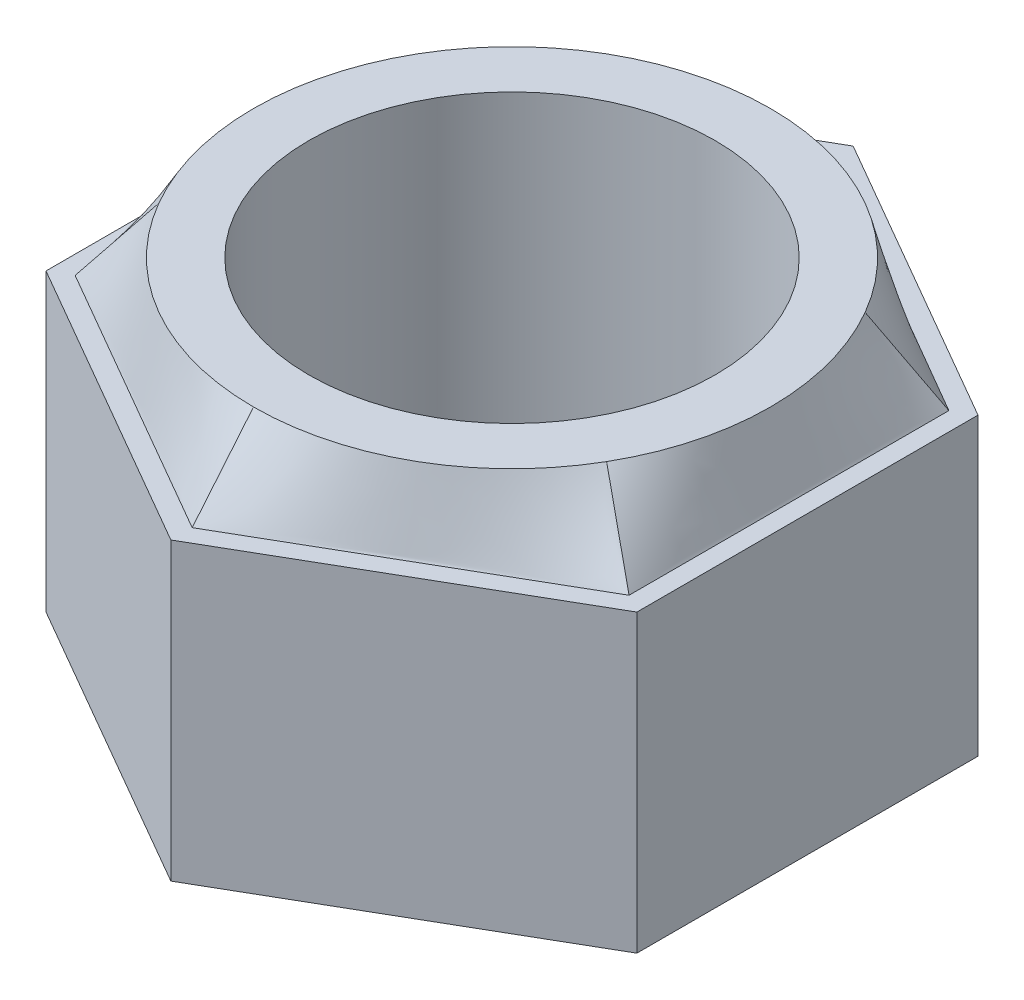
ISO-10303-21;
HEADER;
FILE_DESCRIPTION(('STEP AP214'),'2;1');
FILE_NAME('part.step','',(''),(''),'','','');
FILE_SCHEMA(('AUTOMOTIVE_DESIGN { 1 0 10303 214 1 1 1 1 }'));
ENDSEC;
DATA;
#1=APPLICATION_CONTEXT('core data for automotive mechanical design processes');
#2=APPLICATION_PROTOCOL_DEFINITION('international standard','automotive_design',2000,#1);
#3=PRODUCT_CONTEXT('',#1,'mechanical');
#4=PRODUCT('Part','Part','',(#3));
#5=PRODUCT_RELATED_PRODUCT_CATEGORY('part','',(#4));
#6=PRODUCT_DEFINITION_FORMATION('','',#4);
#7=PRODUCT_DEFINITION_CONTEXT('part definition',#1,'design');
#8=PRODUCT_DEFINITION('design','',#6,#7);
#9=PRODUCT_DEFINITION_SHAPE('','',#8);
#10=(LENGTH_UNIT() NAMED_UNIT(*) SI_UNIT(.MILLI.,.METRE.));
#11=(NAMED_UNIT(*) PLANE_ANGLE_UNIT() SI_UNIT($,.RADIAN.));
#12=(NAMED_UNIT(*) SI_UNIT($,.STERADIAN.) SOLID_ANGLE_UNIT());
#13=UNCERTAINTY_MEASURE_WITH_UNIT(LENGTH_MEASURE(1.E-05),#10,'distance_accuracy_value','');
#14=(GEOMETRIC_REPRESENTATION_CONTEXT(3) GLOBAL_UNCERTAINTY_ASSIGNED_CONTEXT((#13)) GLOBAL_UNIT_ASSIGNED_CONTEXT((#10,
#11,#12)) REPRESENTATION_CONTEXT('',''));
#15=CARTESIAN_POINT('',(0.,0.,0.));
#16=DIRECTION('',(0.,0.,1.));
#17=DIRECTION('',(1.,0.,0.));
#18=AXIS2_PLACEMENT_3D('',#15,#16,#17);
#19=CARTESIAN_POINT('',(0.,4.,0.));
#20=DIRECTION('',(0.,1.,0.));
#21=DIRECTION('',(0.,0.,1.));
#22=AXIS2_PLACEMENT_3D('',#19,#20,#21);
#23=PLANE('',#22);
#24=DIRECTION('',(-0.866025403784441,0.,-0.499999999999995));
#25=VECTOR('',#24,1.);
#26=CARTESIAN_POINT('',(3.99999999999997,4.,-2.30940107675855));
#27=LINE('',#26,#25);
#28=CARTESIAN_POINT('',(3.99999999999997,4.,-2.30940107675855));
#29=VERTEX_POINT('',#28);
#30=CARTESIAN_POINT('',(0.,4.,-4.618802153517));
#31=VERTEX_POINT('',#30);
#32=EDGE_CURVE('E188',#29,#31,#27,.T.);
#33=ORIENTED_EDGE('',*,*,#32,.T.);
#34=DIRECTION('',(-0.866025403784438,0.,0.500000000000001));
#35=VECTOR('',#34,1.);
#36=CARTESIAN_POINT('',(0.,4.,-4.618802153517));
#37=LINE('',#36,#35);
#38=CARTESIAN_POINT('',(-4.,4.,-2.30940107675849));
#39=VERTEX_POINT('',#38);
#40=EDGE_CURVE('E139',#31,#39,#37,.T.);
#41=ORIENTED_EDGE('',*,*,#40,.T.);
#42=DIRECTION('',(0.,0.,1.));
#43=VECTOR('',#42,1.);
#44=CARTESIAN_POINT('',(-4.,4.,-2.30940107675849));
#45=LINE('',#44,#43);
#46=CARTESIAN_POINT('',(-3.99999999999998,4.,2.30940107675852));
#47=VERTEX_POINT('',#46);
#48=EDGE_CURVE('E155',#39,#47,#45,.T.);
#49=ORIENTED_EDGE('',*,*,#48,.T.);
#50=DIRECTION('',(0.866025403784441,0.,0.499999999999995));
#51=VECTOR('',#50,1.);
#52=CARTESIAN_POINT('',(-3.99999999999998,4.,2.30940107675852));
#53=LINE('',#52,#51);
#54=CARTESIAN_POINT('',(0.,4.,4.618802153517));
#55=VERTEX_POINT('',#54);
#56=EDGE_CURVE('E148',#47,#55,#53,.T.);
#57=ORIENTED_EDGE('',*,*,#56,.T.);
#58=DIRECTION('',(0.866025403784434,0.,-0.500000000000007));
#59=VECTOR('',#58,1.);
#60=CARTESIAN_POINT('',(0.,4.,4.618802153517));
#61=LINE('',#60,#59);
#62=CARTESIAN_POINT('',(4.00000000000002,4.,2.30940107675846));
#63=VERTEX_POINT('',#62);
#64=EDGE_CURVE('E152',#55,#63,#61,.T.);
#65=ORIENTED_EDGE('',*,*,#64,.T.);
#66=DIRECTION('',(0.,0.,-1.));
#67=VECTOR('',#66,1.);
#68=CARTESIAN_POINT('',(4.00000000000002,4.,2.30940107675846));
#69=LINE('',#68,#67);
#70=EDGE_CURVE('E104',#63,#29,#69,.T.);
#71=ORIENTED_EDGE('',*,*,#70,.T.);
#72=EDGE_LOOP('',(#33,#41,#49,#57,#65,#71));
#73=FACE_BOUND('',#72,.T.);
#74=DIRECTION('',(-0.866025403784442,0.,-0.499999999999995));
#75=VECTOR('',#74,1.);
#76=CARTESIAN_POINT('',(3.74999999999997,4.,-2.16506350946114));
#77=LINE('',#76,#75);
#78=CARTESIAN_POINT('',(3.74999999999997,4.,-2.16506350946114));
#79=VERTEX_POINT('',#78);
#80=CARTESIAN_POINT('',(0.,4.,-4.33012701892219));
#81=VERTEX_POINT('',#80);
#82=EDGE_CURVE('E196',#79,#81,#77,.T.);
#83=ORIENTED_EDGE('',*,*,#82,.F.);
#84=DIRECTION('',(0.,0.,-1.));
#85=VECTOR('',#84,1.);
#86=CARTESIAN_POINT('',(3.75000000000001,4.,2.16506350946106));
#87=LINE('',#86,#85);
#88=CARTESIAN_POINT('',(3.75000000000001,4.,2.16506350946106));
#89=VERTEX_POINT('',#88);
#90=EDGE_CURVE('E194',#89,#79,#87,.T.);
#91=ORIENTED_EDGE('',*,*,#90,.F.);
#92=DIRECTION('',(0.866025403784435,0.,-0.500000000000007));
#93=VECTOR('',#92,1.);
#94=CARTESIAN_POINT('',(0.,4.,4.33012701892219));
#95=LINE('',#94,#93);
#96=CARTESIAN_POINT('',(0.,4.,4.33012701892219));
#97=VERTEX_POINT('',#96);
#98=EDGE_CURVE('E200',#97,#89,#95,.T.);
#99=ORIENTED_EDGE('',*,*,#98,.F.);
#100=DIRECTION('',(0.866025403784441,0.,0.499999999999995));
#101=VECTOR('',#100,1.);
#102=CARTESIAN_POINT('',(-3.74999999999998,4.,2.16506350946111));
#103=LINE('',#102,#101);
#104=CARTESIAN_POINT('',(-3.74999999999998,4.,2.16506350946111));
#105=VERTEX_POINT('',#104);
#106=EDGE_CURVE('E204',#105,#97,#103,.T.);
#107=ORIENTED_EDGE('',*,*,#106,.F.);
#108=DIRECTION('',(0.,0.,1.));
#109=VECTOR('',#108,1.);
#110=CARTESIAN_POINT('',(-3.75,4.,-2.16506350946108));
#111=LINE('',#110,#109);
#112=CARTESIAN_POINT('',(-3.75,4.,-2.16506350946108));
#113=VERTEX_POINT('',#112);
#114=EDGE_CURVE('E209',#113,#105,#111,.T.);
#115=ORIENTED_EDGE('',*,*,#114,.F.);
#116=DIRECTION('',(-0.866025403784438,0.,0.500000000000001));
#117=VECTOR('',#116,1.);
#118=CARTESIAN_POINT('',(0.,4.,-4.33012701892219));
#119=LINE('',#118,#117);
#120=EDGE_CURVE('E214',#81,#113,#119,.T.);
#121=ORIENTED_EDGE('',*,*,#120,.F.);
#122=EDGE_LOOP('',(#83,#91,#99,#107,#115,#121));
#123=FACE_BOUND('',#122,.T.);
#124=ADVANCED_FACE('F78',(#73,#123),#23,.T.);
#125=CARTESIAN_POINT('',(3.99999999999997,4.,-2.30940107675855));
#126=DIRECTION('',(-0.499999999999995,0.,0.866025403784441));
#127=DIRECTION('',(0.866025403784442,0.,0.499999999999995));
#128=AXIS2_PLACEMENT_3D('',#125,#126,#127);
#129=PLANE('',#128);
#130=DIRECTION('',(-0.866025403784441,0.,-0.499999999999995));
#131=VECTOR('',#130,1.);
#132=CARTESIAN_POINT('',(3.99999999999997,0.,-2.30940107675855));
#133=LINE('',#132,#131);
#134=CARTESIAN_POINT('',(3.99999999999997,0.,-2.30940107675855));
#135=VERTEX_POINT('',#134);
#136=CARTESIAN_POINT('',(0.,0.,-4.618802153517));
#137=VERTEX_POINT('',#136);
#138=EDGE_CURVE('E176',#135,#137,#133,.T.);
#139=ORIENTED_EDGE('',*,*,#138,.T.);
#140=DIRECTION('',(0.,-1.,0.));
#141=VECTOR('',#140,1.);
#142=CARTESIAN_POINT('',(0.,4.,-4.618802153517));
#143=LINE('',#142,#141);
#144=EDGE_CURVE('E12',#31,#137,#143,.T.);
#145=ORIENTED_EDGE('',*,*,#144,.F.);
#146=ORIENTED_EDGE('',*,*,#32,.F.);
#147=DIRECTION('',(0.,-1.,0.));
#148=VECTOR('',#147,1.);
#149=CARTESIAN_POINT('',(3.99999999999997,4.,-2.30940107675855));
#150=LINE('',#149,#148);
#151=EDGE_CURVE('E172',#29,#135,#150,.T.);
#152=ORIENTED_EDGE('',*,*,#151,.T.);
#153=EDGE_LOOP('',(#139,#145,#146,#152));
#154=FACE_BOUND('',#153,.T.);
#155=ADVANCED_FACE('F80',(#154),#129,.F.);
#156=CARTESIAN_POINT('',(0.,4.,-4.618802153517));
#157=DIRECTION('',(0.500000000000001,0.,0.866025403784438));
#158=DIRECTION('',(0.866025403784438,0.,-0.500000000000001));
#159=AXIS2_PLACEMENT_3D('',#156,#157,#158);
#160=PLANE('',#159);
#161=DIRECTION('',(-0.866025403784438,0.,0.500000000000001));
#162=VECTOR('',#161,1.);
#163=CARTESIAN_POINT('',(0.,0.,-4.618802153517));
#164=LINE('',#163,#162);
#165=CARTESIAN_POINT('',(-4.,0.,-2.30940107675849));
#166=VERTEX_POINT('',#165);
#167=EDGE_CURVE('E179',#137,#166,#164,.T.);
#168=ORIENTED_EDGE('',*,*,#167,.T.);
#169=DIRECTION('',(0.,-1.,0.));
#170=VECTOR('',#169,1.);
#171=CARTESIAN_POINT('',(-4.,4.,-2.30940107675849));
#172=LINE('',#171,#170);
#173=EDGE_CURVE('E87',#39,#166,#172,.T.);
#174=ORIENTED_EDGE('',*,*,#173,.F.);
#175=ORIENTED_EDGE('',*,*,#40,.F.);
#176=ORIENTED_EDGE('',*,*,#144,.T.);
#177=EDGE_LOOP('',(#168,#174,#175,#176));
#178=FACE_BOUND('',#177,.T.);
#179=ADVANCED_FACE('F463',(#178),#160,.F.);
#180=CARTESIAN_POINT('',(-4.,4.,-2.30940107675849));
#181=DIRECTION('',(1.,0.,0.));
#182=DIRECTION('',(0.,0.,-1.));
#183=AXIS2_PLACEMENT_3D('',#180,#181,#182);
#184=PLANE('',#183);
#185=DIRECTION('',(0.,0.,1.));
#186=VECTOR('',#185,1.);
#187=CARTESIAN_POINT('',(-4.,0.,-2.30940107675849));
#188=LINE('',#187,#186);
#189=CARTESIAN_POINT('',(-3.99999999999998,0.,2.30940107675852));
#190=VERTEX_POINT('',#189);
#191=EDGE_CURVE('E182',#166,#190,#188,.T.);
#192=ORIENTED_EDGE('',*,*,#191,.T.);
#193=DIRECTION('',(0.,-1.,0.));
#194=VECTOR('',#193,1.);
#195=CARTESIAN_POINT('',(-3.99999999999998,4.,2.30940107675852));
#196=LINE('',#195,#194);
#197=EDGE_CURVE('E167',#47,#190,#196,.T.);
#198=ORIENTED_EDGE('',*,*,#197,.F.);
#199=ORIENTED_EDGE('',*,*,#48,.F.);
#200=ORIENTED_EDGE('',*,*,#173,.T.);
#201=EDGE_LOOP('',(#192,#198,#199,#200));
#202=FACE_BOUND('',#201,.T.);
#203=ADVANCED_FACE('F468',(#202),#184,.F.);
#204=CARTESIAN_POINT('',(-3.99999999999998,4.,2.30940107675852));
#205=DIRECTION('',(0.499999999999995,0.,-0.866025403784441));
#206=DIRECTION('',(-0.866025403784442,0.,-0.499999999999995));
#207=AXIS2_PLACEMENT_3D('',#204,#205,#206);
#208=PLANE('',#207);
#209=DIRECTION('',(0.866025403784441,0.,0.499999999999995));
#210=VECTOR('',#209,1.);
#211=CARTESIAN_POINT('',(-3.99999999999998,0.,2.30940107675852));
#212=LINE('',#211,#210);
#213=CARTESIAN_POINT('',(0.,0.,4.618802153517));
#214=VERTEX_POINT('',#213);
#215=EDGE_CURVE('E164',#190,#214,#212,.T.);
#216=ORIENTED_EDGE('',*,*,#215,.T.);
#217=DIRECTION('',(0.,-1.,0.));
#218=VECTOR('',#217,1.);
#219=CARTESIAN_POINT('',(0.,4.,4.618802153517));
#220=LINE('',#219,#218);
#221=EDGE_CURVE('E161',#55,#214,#220,.T.);
#222=ORIENTED_EDGE('',*,*,#221,.F.);
#223=ORIENTED_EDGE('',*,*,#56,.F.);
#224=ORIENTED_EDGE('',*,*,#197,.T.);
#225=EDGE_LOOP('',(#216,#222,#223,#224));
#226=FACE_BOUND('',#225,.T.);
#227=ADVANCED_FACE('F162',(#226),#208,.F.);
#228=CARTESIAN_POINT('',(0.,4.,4.618802153517));
#229=DIRECTION('',(-0.500000000000007,0.,-0.866025403784435));
#230=DIRECTION('',(-0.866025403784434,0.,0.500000000000007));
#231=AXIS2_PLACEMENT_3D('',#228,#229,#230);
#232=PLANE('',#231);
#233=DIRECTION('',(0.866025403784434,0.,-0.500000000000007));
#234=VECTOR('',#233,1.);
#235=CARTESIAN_POINT('',(0.,0.,4.618802153517));
#236=LINE('',#235,#234);
#237=CARTESIAN_POINT('',(4.00000000000002,0.,2.30940107675846));
#238=VERTEX_POINT('',#237);
#239=EDGE_CURVE('E185',#214,#238,#236,.T.);
#240=ORIENTED_EDGE('',*,*,#239,.T.);
#241=DIRECTION('',(0.,-1.,0.));
#242=VECTOR('',#241,1.);
#243=CARTESIAN_POINT('',(4.00000000000002,4.,2.30940107675846));
#244=LINE('',#243,#242);
#245=EDGE_CURVE('E168',#63,#238,#244,.T.);
#246=ORIENTED_EDGE('',*,*,#245,.F.);
#247=ORIENTED_EDGE('',*,*,#64,.F.);
#248=ORIENTED_EDGE('',*,*,#221,.T.);
#249=EDGE_LOOP('',(#240,#246,#247,#248));
#250=FACE_BOUND('',#249,.T.);
#251=ADVANCED_FACE('F170',(#250),#232,.F.);
#252=CARTESIAN_POINT('',(4.00000000000002,4.,2.30940107675846));
#253=DIRECTION('',(-1.,0.,0.));
#254=DIRECTION('',(0.,0.,1.));
#255=AXIS2_PLACEMENT_3D('',#252,#253,#254);
#256=PLANE('',#255);
#257=DIRECTION('',(0.,0.,-1.));
#258=VECTOR('',#257,1.);
#259=CARTESIAN_POINT('',(4.00000000000002,0.,2.30940107675846));
#260=LINE('',#259,#258);
#261=EDGE_CURVE('E131',#238,#135,#260,.T.);
#262=ORIENTED_EDGE('',*,*,#261,.T.);
#263=ORIENTED_EDGE('',*,*,#151,.F.);
#264=ORIENTED_EDGE('',*,*,#70,.F.);
#265=ORIENTED_EDGE('',*,*,#245,.T.);
#266=EDGE_LOOP('',(#262,#263,#264,#265));
#267=FACE_BOUND('',#266,.T.);
#268=ADVANCED_FACE('F484',(#267),#256,.F.);
#269=CARTESIAN_POINT('',(0.,0.,0.));
#270=DIRECTION('',(0.,1.,0.));
#271=DIRECTION('',(0.,0.,1.));
#272=AXIS2_PLACEMENT_3D('',#269,#270,#271);
#273=PLANE('',#272);
#274=CARTESIAN_POINT('',(0.,0.,0.));
#275=DIRECTION('',(0.,1.,0.));
#276=DIRECTION('',(0.,0.,1.));
#277=AXIS2_PLACEMENT_3D('',#274,#275,#276);
#278=CIRCLE('',#277,2.75);
#279=CARTESIAN_POINT('',(0.,0.,2.75));
#280=VERTEX_POINT('',#279);
#281=EDGE_CURVE('E197',#280,#280,#278,.T.);
#282=ORIENTED_EDGE('',*,*,#281,.T.);
#283=EDGE_LOOP('',(#282));
#284=FACE_BOUND('',#283,.T.);
#285=ORIENTED_EDGE('',*,*,#138,.F.);
#286=ORIENTED_EDGE('',*,*,#261,.F.);
#287=ORIENTED_EDGE('',*,*,#239,.F.);
#288=ORIENTED_EDGE('',*,*,#215,.F.);
#289=ORIENTED_EDGE('',*,*,#191,.F.);
#290=ORIENTED_EDGE('',*,*,#167,.F.);
#291=EDGE_LOOP('',(#285,#286,#287,#288,#289,#290));
#292=FACE_BOUND('',#291,.T.);
#293=ADVANCED_FACE('F307',(#284,#292),#273,.F.);
#294=CARTESIAN_POINT('',(0.,5.,0.));
#295=DIRECTION('',(0.,1.,0.));
#296=DIRECTION('',(0.,0.,1.));
#297=AXIS2_PLACEMENT_3D('',#294,#295,#296);
#298=PLANE('',#297);
#299=CARTESIAN_POINT('',(0.,5.,0.));
#300=DIRECTION('',(0.,1.,0.));
#301=DIRECTION('',(0.,0.,1.));
#302=AXIS2_PLACEMENT_3D('',#299,#300,#301);
#303=CIRCLE('',#302,2.74999999999999);
#304=CARTESIAN_POINT('',(0.,5.,2.74999999999999));
#305=VERTEX_POINT('',#304);
#306=EDGE_CURVE('E450',#305,#305,#303,.T.);
#307=ORIENTED_EDGE('',*,*,#306,.F.);
#308=EDGE_LOOP('',(#307));
#309=FACE_BOUND('',#308,.T.);
#310=CARTESIAN_POINT('',(0.,5.,0.));
#311=DIRECTION('',(0.,1.,0.));
#312=DIRECTION('',(0.,0.,1.));
#313=AXIS2_PLACEMENT_3D('',#310,#311,#312);
#314=CIRCLE('',#313,3.5);
#315=CARTESIAN_POINT('',(0.,5.,-3.5));
#316=VERTEX_POINT('',#315);
#317=CARTESIAN_POINT('',(-3.03108891324554,5.,-1.74999999999999));
#318=VERTEX_POINT('',#317);
#319=EDGE_CURVE('E180',#316,#318,#314,.T.);
#320=ORIENTED_EDGE('',*,*,#319,.T.);
#321=CARTESIAN_POINT('',(-3.03108891324553,5.,1.75000000000002));
#322=VERTEX_POINT('',#321);
#323=EDGE_CURVE('E362',#318,#322,#314,.T.);
#324=ORIENTED_EDGE('',*,*,#323,.T.);
#325=CARTESIAN_POINT('',(0.,5.,3.5));
#326=VERTEX_POINT('',#325);
#327=EDGE_CURVE('E261',#322,#326,#314,.T.);
#328=ORIENTED_EDGE('',*,*,#327,.T.);
#329=CARTESIAN_POINT('',(3.03108891324555,5.,1.74999999999998));
#330=VERTEX_POINT('',#329);
#331=EDGE_CURVE('E350',#326,#330,#314,.T.);
#332=ORIENTED_EDGE('',*,*,#331,.T.);
#333=CARTESIAN_POINT('',(3.03108891324552,5.,-1.75000000000003));
#334=VERTEX_POINT('',#333);
#335=EDGE_CURVE('E342',#330,#334,#314,.T.);
#336=ORIENTED_EDGE('',*,*,#335,.T.);
#337=EDGE_CURVE('E239',#334,#316,#314,.T.);
#338=ORIENTED_EDGE('',*,*,#337,.T.);
#339=EDGE_LOOP('',(#320,#324,#328,#332,#336,#338));
#340=FACE_BOUND('',#339,.T.);
#341=ADVANCED_FACE('F298',(#309,#340),#298,.T.);
#342=CARTESIAN_POINT('',(-3.75,4.,-2.16506350946108));
#343=CARTESIAN_POINT('',(-3.03108891324554,5.,-1.74999999999999));
#344=CARTESIAN_POINT('',(-3.75,4.,-1.80421959121757));
#345=CARTESIAN_POINT('',(-3.17692224657887,5.,-1.49740925722953));
#346=CARTESIAN_POINT('',(-3.75,4.,-1.44337567297405));
#347=CARTESIAN_POINT('',(-3.29573609316826,5.,-1.21755127798345));
#348=CARTESIAN_POINT('',(-3.74999999999999,4.,-0.721687836487019));
#349=CARTESIAN_POINT('',(-3.45740611087872,5.,-0.625020395498908));
#350=CARTESIAN_POINT('',(-3.74999999999999,4.,-0.360843918243503));
#351=CARTESIAN_POINT('',(-3.5,5.,-0.312607391169627));
#352=CARTESIAN_POINT('',(-3.74999999999999,4.,0.36084391824353));
#353=CARTESIAN_POINT('',(-3.5,5.,0.31260739116966));
#354=CARTESIAN_POINT('',(-3.74999999999999,4.,0.721687836487046));
#355=CARTESIAN_POINT('',(-3.45740611087871,5.,0.62502039549894));
#356=CARTESIAN_POINT('',(-3.74999999999998,4.,1.44337567297408));
#357=CARTESIAN_POINT('',(-3.29573609316825,5.,1.21755127798348));
#358=CARTESIAN_POINT('',(-3.74999999999998,4.,1.80421959121759));
#359=CARTESIAN_POINT('',(-3.17692224657886,5.,1.49740925722956));
#360=CARTESIAN_POINT('',(-3.74999999999998,4.,2.16506350946111));
#361=CARTESIAN_POINT('',(-3.03108891324553,5.,1.75000000000002));
#362=B_SPLINE_SURFACE_WITH_KNOTS('',3,1,((#342,#343),(#344,#345),(#346,#347),(#348,#349),(#350,
#351),(#352,#353),(#354,#355),(#356,#357),(#358,#359),(#360,#361)),.UNSPECIFIED.,.F.,.F.,.F.,(4,
2,2,2,4),(2,2),(0.,0.25,0.5,0.75,1.),(0.,1.),.UNSPECIFIED.);
#363=DIRECTION('',(0.553154058430196,0.769433200602628,-0.319363644538009));
#364=VECTOR('',#363,1.);
#365=CARTESIAN_POINT('',(-3.39054445662275,4.5,1.95753175473056));
#366=LINE('',#365,#364);
#367=EDGE_CURVE('E252',#105,#322,#366,.T.);
#368=DIRECTION('',(-0.553154058430195,-0.769433200602628,-0.31936364453801));
#369=VECTOR('',#368,1.);
#370=CARTESIAN_POINT('',(-3.39054445662277,4.5,-1.95753175473054));
#371=LINE('',#370,#369);
#372=EDGE_CURVE('E203',#318,#113,#371,.T.);
#373=ORIENTED_EDGE('',*,*,#114,.T.);
#374=ORIENTED_EDGE('',*,*,#367,.T.);
#375=ORIENTED_EDGE('',*,*,#323,.F.);
#376=ORIENTED_EDGE('',*,*,#372,.T.);
#377=EDGE_LOOP('',(#373,#374,#375,#376));
#378=FACE_BOUND('',#377,.T.);
#379=ADVANCED_FACE('F249',(#378),#362,.T.);
#380=CARTESIAN_POINT('',(-3.74999999999998,4.,2.16506350946111));
#381=CARTESIAN_POINT('',(-3.03108891324553,5.,1.75000000000002));
#382=CARTESIAN_POINT('',(-3.43749999999998,4.,2.34548546858287));
#383=CARTESIAN_POINT('',(-2.88525557991219,5.,2.00259074277048));
#384=CARTESIAN_POINT('',(-3.12499999999998,4.,2.52590742770462));
#385=CARTESIAN_POINT('',(-2.70229838372801,5.,2.24541554186126));
#386=CARTESIAN_POINT('',(-2.49999999999998,4.,2.88675134594813));
#387=CARTESIAN_POINT('',(-2.26998659582481,5.,2.68169132547107));
#388=CARTESIAN_POINT('',(-2.18749999999998,4.,3.06717330506989));
#389=CARTESIAN_POINT('',(-2.02072594216368,5.,2.87478521766072));
#390=CARTESIAN_POINT('',(-1.56249999999998,4.,3.4280172233134));
#391=CARTESIAN_POINT('',(-1.4792740578363,5.,3.18739260883036));
#392=CARTESIAN_POINT('',(-1.24999999999998,4.,3.60843918243516));
#393=CARTESIAN_POINT('',(-1.18741951505389,5.,3.30671172096999));
#394=CARTESIAN_POINT('',(-0.624999999999975,4.,3.96928310067867));
#395=CARTESIAN_POINT('',(-0.593437709440234,5.,3.46296681984472));
#396=CARTESIAN_POINT('',(-0.312499999999973,4.,4.14970505980043));
#397=CARTESIAN_POINT('',(-0.291666666666665,5.,3.5));
#398=CARTESIAN_POINT('',(0.,4.,4.33012701892218));
#399=CARTESIAN_POINT('',(0.,5.,3.5));
#400=B_SPLINE_SURFACE_WITH_KNOTS('',3,1,((#380,#381),(#382,#383),(#384,#385),(#386,#387),(#388,
#389),(#390,#391),(#392,#393),(#394,#395),(#396,#397),(#398,#399)),.UNSPECIFIED.,.F.,.F.,.F.,(4,
2,2,2,4),(2,2),(0.,0.25,0.5,0.75,1.),(0.,1.),.UNSPECIFIED.);
#401=DIRECTION('',(0.,0.769433200602628,-0.638727289076015));
#402=VECTOR('',#401,1.);
#403=CARTESIAN_POINT('',(0.,4.5,3.91506350946109));
#404=LINE('',#403,#402);
#405=EDGE_CURVE('E263',#97,#326,#404,.T.);
#406=ORIENTED_EDGE('',*,*,#106,.T.);
#407=ORIENTED_EDGE('',*,*,#405,.T.);
#408=ORIENTED_EDGE('',*,*,#327,.F.);
#409=ORIENTED_EDGE('',*,*,#367,.F.);
#410=EDGE_LOOP('',(#406,#407,#408,#409));
#411=FACE_BOUND('',#410,.T.);
#412=ADVANCED_FACE('F257',(#411),#400,.T.);
#413=CARTESIAN_POINT('',(0.,4.,-4.33012701892219));
#414=CARTESIAN_POINT('',(0.,5.,-3.5));
#415=CARTESIAN_POINT('',(-0.312499999999999,4.,-4.14970505980043));
#416=CARTESIAN_POINT('',(-0.29166666666667,5.,-3.5));
#417=CARTESIAN_POINT('',(-0.624999999999999,4.,-3.96928310067867));
#418=CARTESIAN_POINT('',(-0.593437709440241,5.,-3.46296681984472));
#419=CARTESIAN_POINT('',(-1.25,4.,-3.60843918243515));
#420=CARTESIAN_POINT('',(-1.1874195150539,5.,-3.30671172096998));
#421=CARTESIAN_POINT('',(-1.5625,4.,-3.42801722331339));
#422=CARTESIAN_POINT('',(-1.47927405783632,5.,-3.18739260883035));
#423=CARTESIAN_POINT('',(-2.1875,4.,-3.06717330506988));
#424=CARTESIAN_POINT('',(-2.0207259421637,5.,-2.87478521766071));
#425=CARTESIAN_POINT('',(-2.5,4.,-2.88675134594812));
#426=CARTESIAN_POINT('',(-2.26998659582483,5.,-2.68169132547106));
#427=CARTESIAN_POINT('',(-3.125,4.,-2.5259074277046));
#428=CARTESIAN_POINT('',(-2.70229838372802,5.,-2.24541554186124));
#429=CARTESIAN_POINT('',(-3.4375,4.,-2.34548546858284));
#430=CARTESIAN_POINT('',(-2.88525557991221,5.,-2.00259074277045));
#431=CARTESIAN_POINT('',(-3.75,4.,-2.16506350946108));
#432=CARTESIAN_POINT('',(-3.03108891324554,5.,-1.74999999999999));
#433=B_SPLINE_SURFACE_WITH_KNOTS('',3,1,((#413,#414),(#415,#416),(#417,#418),(#419,#420),(#421,
#422),(#423,#424),(#425,#426),(#427,#428),(#429,#430),(#431,#432)),.UNSPECIFIED.,.F.,.F.,.F.,(4,
2,2,2,4),(2,2),(0.,0.25,0.5,0.75,1.),(0.,1.),.UNSPECIFIED.);
#434=DIRECTION('',(0.,0.769433200602628,0.638727289076016));
#435=VECTOR('',#434,1.);
#436=CARTESIAN_POINT('',(0.,4.5,-3.91506350946109));
#437=LINE('',#436,#435);
#438=EDGE_CURVE('E226',#81,#316,#437,.T.);
#439=ORIENTED_EDGE('',*,*,#120,.T.);
#440=ORIENTED_EDGE('',*,*,#372,.F.);
#441=ORIENTED_EDGE('',*,*,#319,.F.);
#442=ORIENTED_EDGE('',*,*,#438,.F.);
#443=EDGE_LOOP('',(#439,#440,#441,#442));
#444=FACE_BOUND('',#443,.T.);
#445=ADVANCED_FACE('F233',(#444),#433,.T.);
#446=CARTESIAN_POINT('',(0.,4.,4.33012701892219));
#447=CARTESIAN_POINT('',(0.,5.,3.5));
#448=CARTESIAN_POINT('',(0.312500000000029,4.,4.14970505980043));
#449=CARTESIAN_POINT('',(0.291666666666668,5.,3.5));
#450=CARTESIAN_POINT('',(0.625000000000028,4.,3.96928310067866));
#451=CARTESIAN_POINT('',(0.593437709440241,5.,3.46296681984472));
#452=CARTESIAN_POINT('',(1.25000000000003,4.,3.60843918243514));
#453=CARTESIAN_POINT('',(1.1874195150539,5.,3.30671172096998));
#454=CARTESIAN_POINT('',(1.56250000000002,4.,3.42801722331338));
#455=CARTESIAN_POINT('',(1.47927405783632,5.,3.18739260883035));
#456=CARTESIAN_POINT('',(2.18750000000002,4.,3.06717330506986));
#457=CARTESIAN_POINT('',(2.0207259421637,5.,2.87478521766071));
#458=CARTESIAN_POINT('',(2.50000000000002,4.,2.8867513459481));
#459=CARTESIAN_POINT('',(2.26998659582484,5.,2.68169132547105));
#460=CARTESIAN_POINT('',(3.12500000000002,4.,2.52590742770458));
#461=CARTESIAN_POINT('',(2.70229838372803,5.,2.24541554186124));
#462=CARTESIAN_POINT('',(3.43750000000002,4.,2.34548546858282));
#463=CARTESIAN_POINT('',(2.88525557991222,5.,2.00259074277044));
#464=CARTESIAN_POINT('',(3.75000000000001,4.,2.16506350946106));
#465=CARTESIAN_POINT('',(3.03108891324555,5.,1.74999999999998));
#466=B_SPLINE_SURFACE_WITH_KNOTS('',3,1,((#446,#447),(#448,#449),(#450,#451),(#452,#453),(#454,
#455),(#456,#457),(#458,#459),(#460,#461),(#462,#463),(#464,#465)),.UNSPECIFIED.,.F.,.F.,.F.,(4,
2,2,2,4),(2,2),(0.,0.25,0.5,0.75,1.),(0.,1.),.UNSPECIFIED.);
#467=DIRECTION('',(-0.553154058430203,0.769433200602628,-0.319363644537996));
#468=VECTOR('',#467,1.);
#469=CARTESIAN_POINT('',(3.39054445662278,4.5,1.95753175473052));
#470=LINE('',#469,#468);
#471=EDGE_CURVE('E265',#89,#330,#470,.T.);
#472=ORIENTED_EDGE('',*,*,#98,.T.);
#473=ORIENTED_EDGE('',*,*,#471,.T.);
#474=ORIENTED_EDGE('',*,*,#331,.F.);
#475=ORIENTED_EDGE('',*,*,#405,.F.);
#476=EDGE_LOOP('',(#472,#473,#474,#475));
#477=FACE_BOUND('',#476,.T.);
#478=ADVANCED_FACE('F406',(#477),#466,.T.);
#479=CARTESIAN_POINT('',(3.75000000000001,4.,2.16506350946106));
#480=CARTESIAN_POINT('',(3.03108891324555,5.,1.74999999999998));
#481=CARTESIAN_POINT('',(3.75000000000001,4.,1.80421959121754));
#482=CARTESIAN_POINT('',(3.17692224657888,5.,1.49740925722952));
#483=CARTESIAN_POINT('',(3.75,4.,1.44337567297403));
#484=CARTESIAN_POINT('',(3.29573609316826,5.,1.21755127798344));
#485=CARTESIAN_POINT('',(3.75,4.,0.721687836486994));
#486=CARTESIAN_POINT('',(3.45740611087872,5.,0.625020395498895));
#487=CARTESIAN_POINT('',(3.74999999999999,4.,0.360843918243478));
#488=CARTESIAN_POINT('',(3.5,5.,0.312607391169613));
#489=CARTESIAN_POINT('',(3.74999999999999,4.,-0.360843918243554));
#490=CARTESIAN_POINT('',(3.5,5.,-0.312607391169675));
#491=CARTESIAN_POINT('',(3.74999999999998,4.,-0.72168783648707));
#492=CARTESIAN_POINT('',(3.45740611087871,5.,-0.625020395498957));
#493=CARTESIAN_POINT('',(3.74999999999997,4.,-1.4433756729741));
#494=CARTESIAN_POINT('',(3.29573609316824,5.,-1.2175512779835));
#495=CARTESIAN_POINT('',(3.74999999999997,4.,-1.80421959121762));
#496=CARTESIAN_POINT('',(3.17692224657885,5.,-1.49740925722957));
#497=CARTESIAN_POINT('',(3.74999999999997,4.,-2.16506350946114));
#498=CARTESIAN_POINT('',(3.03108891324552,5.,-1.75000000000003));
#499=B_SPLINE_SURFACE_WITH_KNOTS('',3,1,((#479,#480),(#481,#482),(#483,#484),(#485,#486),(#487,
#488),(#489,#490),(#491,#492),(#493,#494),(#495,#496),(#497,#498)),.UNSPECIFIED.,.F.,.F.,.F.,(4,
2,2,2,4),(2,2),(0.,0.25,0.5,0.75,1.),(0.,1.),.UNSPECIFIED.);
#500=DIRECTION('',(-0.553154058430191,0.769433200602628,0.319363644538017));
#501=VECTOR('',#500,1.);
#502=CARTESIAN_POINT('',(3.39054445662274,4.5,-1.95753175473059));
#503=LINE('',#502,#501);
#504=EDGE_CURVE('E95',#79,#334,#503,.T.);
#505=ORIENTED_EDGE('',*,*,#90,.T.);
#506=ORIENTED_EDGE('',*,*,#504,.T.);
#507=ORIENTED_EDGE('',*,*,#335,.F.);
#508=ORIENTED_EDGE('',*,*,#471,.F.);
#509=EDGE_LOOP('',(#505,#506,#507,#508));
#510=FACE_BOUND('',#509,.T.);
#511=ADVANCED_FACE('F293',(#510),#499,.T.);
#512=CARTESIAN_POINT('',(3.74999999999997,4.,-2.16506350946114));
#513=CARTESIAN_POINT('',(3.03108891324552,5.,-1.75000000000003));
#514=CARTESIAN_POINT('',(3.43749999999997,4.,-2.34548546858289));
#515=CARTESIAN_POINT('',(2.88525557991218,5.,-2.00259074277049));
#516=CARTESIAN_POINT('',(3.12499999999997,4.,-2.52590742770465));
#517=CARTESIAN_POINT('',(2.70229838372799,5.,-2.24541554186128));
#518=CARTESIAN_POINT('',(2.49999999999998,4.,-2.88675134594815));
#519=CARTESIAN_POINT('',(2.2699865958248,5.,-2.68169132547108));
#520=CARTESIAN_POINT('',(2.18749999999998,4.,-3.06717330506991));
#521=CARTESIAN_POINT('',(2.02072594216367,5.,-2.87478521766073));
#522=CARTESIAN_POINT('',(1.56249999999999,4.,-3.42801722331341));
#523=CARTESIAN_POINT('',(1.47927405783629,5.,-3.18739260883036));
#524=CARTESIAN_POINT('',(1.24999999999999,4.,-3.60843918243517));
#525=CARTESIAN_POINT('',(1.18741951505388,5.,-3.30671172096999));
#526=CARTESIAN_POINT('',(0.624999999999996,4.,-3.96928310067868));
#527=CARTESIAN_POINT('',(0.593437709440229,5.,-3.46296681984472));
#528=CARTESIAN_POINT('',(0.312499999999998,4.,-4.14970505980043));
#529=CARTESIAN_POINT('',(0.291666666666661,5.,-3.5));
#530=CARTESIAN_POINT('',(0.,4.,-4.33012701892219));
#531=CARTESIAN_POINT('',(0.,5.,-3.5));
#532=B_SPLINE_SURFACE_WITH_KNOTS('',3,1,((#512,#513),(#514,#515),(#516,#517),(#518,#519),(#520,
#521),(#522,#523),(#524,#525),(#526,#527),(#528,#529),(#530,#531)),.UNSPECIFIED.,.F.,.F.,.F.,(4,
2,2,2,4),(2,2),(0.,0.25,0.5,0.75,1.),(0.,1.),.UNSPECIFIED.);
#533=ORIENTED_EDGE('',*,*,#82,.T.);
#534=ORIENTED_EDGE('',*,*,#438,.T.);
#535=ORIENTED_EDGE('',*,*,#337,.F.);
#536=ORIENTED_EDGE('',*,*,#504,.F.);
#537=EDGE_LOOP('',(#533,#534,#535,#536));
#538=FACE_BOUND('',#537,.T.);
#539=ADVANCED_FACE('F224',(#538),#532,.T.);
#540=CARTESIAN_POINT('',(0.,5.,0.));
#541=DIRECTION('',(0.,1.,0.));
#542=DIRECTION('',(0.,0.,1.));
#543=AXIS2_PLACEMENT_3D('',#540,#541,#542);
#544=CYLINDRICAL_SURFACE('',#543,2.74999999999999);
#545=ORIENTED_EDGE('',*,*,#281,.F.);
#546=EDGE_LOOP('',(#545));
#547=FACE_BOUND('',#546,.T.);
#548=ORIENTED_EDGE('',*,*,#306,.T.);
#549=EDGE_LOOP('',(#548));
#550=FACE_BOUND('',#549,.T.);
#551=ADVANCED_FACE('F292',(#547,#550),#544,.F.);
#552=CLOSED_SHELL('',(#124,#155,#179,#203,#227,#251,#268,#293,#341,#379,#412,#445,#478,#511,
#539,#551));
#553=MANIFOLD_SOLID_BREP('B2',#552);
#554=ADVANCED_BREP_SHAPE_REPRESENTATION('',(#18,#553),#14);
#555=SHAPE_DEFINITION_REPRESENTATION(#9,#554);
ENDSEC;
END-ISO-10303-21;
